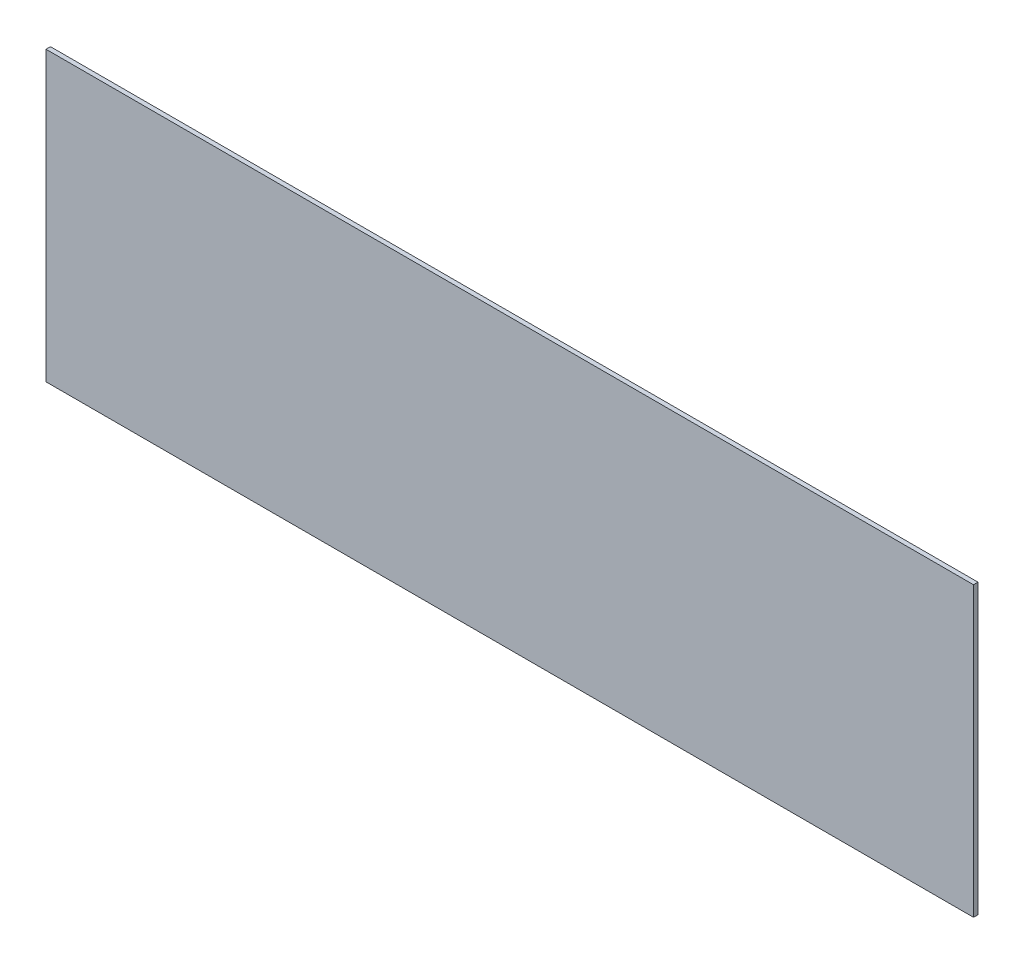
ISO-10303-21;
HEADER;
FILE_DESCRIPTION(('STEP AP214'),'2;1');
FILE_NAME('part.step','',(''),(''),'','','');
FILE_SCHEMA(('AUTOMOTIVE_DESIGN { 1 0 10303 214 1 1 1 1 }'));
ENDSEC;
DATA;
#1=APPLICATION_CONTEXT('core data for automotive mechanical design processes');
#2=APPLICATION_PROTOCOL_DEFINITION('international standard','automotive_design',2000,#1);
#3=PRODUCT_CONTEXT('',#1,'mechanical');
#4=PRODUCT('Part','Part','',(#3));
#5=PRODUCT_RELATED_PRODUCT_CATEGORY('part','',(#4));
#6=PRODUCT_DEFINITION_FORMATION('','',#4);
#7=PRODUCT_DEFINITION_CONTEXT('part definition',#1,'design');
#8=PRODUCT_DEFINITION('design','',#6,#7);
#9=PRODUCT_DEFINITION_SHAPE('','',#8);
#10=(LENGTH_UNIT() NAMED_UNIT(*) SI_UNIT(.MILLI.,.METRE.));
#11=(NAMED_UNIT(*) PLANE_ANGLE_UNIT() SI_UNIT($,.RADIAN.));
#12=(NAMED_UNIT(*) SI_UNIT($,.STERADIAN.) SOLID_ANGLE_UNIT());
#13=UNCERTAINTY_MEASURE_WITH_UNIT(LENGTH_MEASURE(1.E-05),#10,'distance_accuracy_value','');
#14=(GEOMETRIC_REPRESENTATION_CONTEXT(3) GLOBAL_UNCERTAINTY_ASSIGNED_CONTEXT((#13)) GLOBAL_UNIT_ASSIGNED_CONTEXT((#10,
#11,#12)) REPRESENTATION_CONTEXT('',''));
#15=CARTESIAN_POINT('',(0.,0.,0.));
#16=DIRECTION('',(0.,0.,1.));
#17=DIRECTION('',(1.,0.,0.));
#18=AXIS2_PLACEMENT_3D('',#15,#16,#17);
#19=CARTESIAN_POINT('',(0.,0.,3.175));
#20=DIRECTION('',(-1.,0.,0.));
#21=DIRECTION('',(0.,-1.,0.));
#22=AXIS2_PLACEMENT_3D('',#19,#20,#21);
#23=PLANE('',#22);
#24=DIRECTION('',(0.,1.,0.));
#25=VECTOR('',#24,1.);
#26=CARTESIAN_POINT('',(0.,0.,0.));
#27=LINE('',#26,#25);
#28=CARTESIAN_POINT('',(0.,0.,0.));
#29=VERTEX_POINT('',#28);
#30=CARTESIAN_POINT('',(0.,204.216,0.));
#31=VERTEX_POINT('',#30);
#32=EDGE_CURVE('E107',#29,#31,#27,.T.);
#33=ORIENTED_EDGE('',*,*,#32,.T.);
#34=DIRECTION('',(0.,0.,-1.));
#35=VECTOR('',#34,1.);
#36=CARTESIAN_POINT('',(0.,204.216,3.175));
#37=LINE('',#36,#35);
#38=CARTESIAN_POINT('',(0.,204.216,3.175));
#39=VERTEX_POINT('',#38);
#40=EDGE_CURVE('E11',#39,#31,#37,.T.);
#41=ORIENTED_EDGE('',*,*,#40,.F.);
#42=DIRECTION('',(0.,1.,0.));
#43=VECTOR('',#42,1.);
#44=CARTESIAN_POINT('',(0.,0.,3.175));
#45=LINE('',#44,#43);
#46=CARTESIAN_POINT('',(0.,0.,3.175));
#47=VERTEX_POINT('',#46);
#48=EDGE_CURVE('E91',#47,#39,#45,.T.);
#49=ORIENTED_EDGE('',*,*,#48,.F.);
#50=DIRECTION('',(0.,0.,-1.));
#51=VECTOR('',#50,1.);
#52=CARTESIAN_POINT('',(0.,0.,3.175));
#53=LINE('',#52,#51);
#54=EDGE_CURVE('E103',#47,#29,#53,.T.);
#55=ORIENTED_EDGE('',*,*,#54,.T.);
#56=EDGE_LOOP('',(#33,#41,#49,#55));
#57=FACE_BOUND('',#56,.T.);
#58=ADVANCED_FACE('F39',(#57),#23,.F.);
#59=CARTESIAN_POINT('',(0.,204.216,3.175));
#60=DIRECTION('',(0.,-1.,0.));
#61=DIRECTION('',(1.,0.,0.));
#62=AXIS2_PLACEMENT_3D('',#59,#60,#61);
#63=PLANE('',#62);
#64=DIRECTION('',(-1.,0.,0.));
#65=VECTOR('',#64,1.);
#66=CARTESIAN_POINT('',(0.,204.216,0.));
#67=LINE('',#66,#65);
#68=CARTESIAN_POINT('',(-657.606,204.216,0.));
#69=VERTEX_POINT('',#68);
#70=EDGE_CURVE('E96',#31,#69,#67,.T.);
#71=ORIENTED_EDGE('',*,*,#70,.T.);
#72=DIRECTION('',(0.,0.,-1.));
#73=VECTOR('',#72,1.);
#74=CARTESIAN_POINT('',(-657.606,204.216,3.175));
#75=LINE('',#74,#73);
#76=CARTESIAN_POINT('',(-657.606,204.216,3.175));
#77=VERTEX_POINT('',#76);
#78=EDGE_CURVE('E48',#77,#69,#75,.T.);
#79=ORIENTED_EDGE('',*,*,#78,.F.);
#80=DIRECTION('',(-1.,0.,0.));
#81=VECTOR('',#80,1.);
#82=CARTESIAN_POINT('',(0.,204.216,3.175));
#83=LINE('',#82,#81);
#84=EDGE_CURVE('E86',#39,#77,#83,.T.);
#85=ORIENTED_EDGE('',*,*,#84,.F.);
#86=ORIENTED_EDGE('',*,*,#40,.T.);
#87=EDGE_LOOP('',(#71,#79,#85,#86));
#88=FACE_BOUND('',#87,.T.);
#89=ADVANCED_FACE('F95',(#88),#63,.F.);
#90=CARTESIAN_POINT('',(-657.606,0.,3.175));
#91=DIRECTION('',(1.,0.,0.));
#92=DIRECTION('',(0.,0.,-1.));
#93=AXIS2_PLACEMENT_3D('',#90,#91,#92);
#94=PLANE('',#93);
#95=DIRECTION('',(0.,-1.,0.));
#96=VECTOR('',#95,1.);
#97=CARTESIAN_POINT('',(-657.606,0.,0.));
#98=LINE('',#97,#96);
#99=CARTESIAN_POINT('',(-657.606,0.,0.));
#100=VERTEX_POINT('',#99);
#101=EDGE_CURVE('E73',#69,#100,#98,.T.);
#102=ORIENTED_EDGE('',*,*,#101,.T.);
#103=DIRECTION('',(0.,0.,-1.));
#104=VECTOR('',#103,1.);
#105=CARTESIAN_POINT('',(-657.606,0.,3.175));
#106=LINE('',#105,#104);
#107=CARTESIAN_POINT('',(-657.606,0.,3.175));
#108=VERTEX_POINT('',#107);
#109=EDGE_CURVE('E98',#108,#100,#106,.T.);
#110=ORIENTED_EDGE('',*,*,#109,.F.);
#111=DIRECTION('',(0.,-1.,0.));
#112=VECTOR('',#111,1.);
#113=CARTESIAN_POINT('',(-657.606,0.,3.175));
#114=LINE('',#113,#112);
#115=EDGE_CURVE('E89',#77,#108,#114,.T.);
#116=ORIENTED_EDGE('',*,*,#115,.F.);
#117=ORIENTED_EDGE('',*,*,#78,.T.);
#118=EDGE_LOOP('',(#102,#110,#116,#117));
#119=FACE_BOUND('',#118,.T.);
#120=ADVANCED_FACE('F99',(#119),#94,.F.);
#121=CARTESIAN_POINT('',(0.,0.,3.175));
#122=DIRECTION('',(0.,1.,0.));
#123=DIRECTION('',(0.,0.,1.));
#124=AXIS2_PLACEMENT_3D('',#121,#122,#123);
#125=PLANE('',#124);
#126=DIRECTION('',(1.,0.,0.));
#127=VECTOR('',#126,1.);
#128=CARTESIAN_POINT('',(0.,0.,0.));
#129=LINE('',#128,#127);
#130=EDGE_CURVE('E79',#100,#29,#129,.T.);
#131=ORIENTED_EDGE('',*,*,#130,.T.);
#132=ORIENTED_EDGE('',*,*,#54,.F.);
#133=DIRECTION('',(1.,0.,0.));
#134=VECTOR('',#133,1.);
#135=CARTESIAN_POINT('',(0.,0.,3.175));
#136=LINE('',#135,#134);
#137=EDGE_CURVE('E56',#108,#47,#136,.T.);
#138=ORIENTED_EDGE('',*,*,#137,.F.);
#139=ORIENTED_EDGE('',*,*,#109,.T.);
#140=EDGE_LOOP('',(#131,#132,#138,#139));
#141=FACE_BOUND('',#140,.T.);
#142=ADVANCED_FACE('F120',(#141),#125,.F.);
#143=CARTESIAN_POINT('',(0.,0.,3.175));
#144=DIRECTION('',(0.,0.,1.));
#145=DIRECTION('',(1.,0.,0.));
#146=AXIS2_PLACEMENT_3D('',#143,#144,#145);
#147=PLANE('',#146);
#148=ORIENTED_EDGE('',*,*,#48,.T.);
#149=ORIENTED_EDGE('',*,*,#84,.T.);
#150=ORIENTED_EDGE('',*,*,#115,.T.);
#151=ORIENTED_EDGE('',*,*,#137,.T.);
#152=EDGE_LOOP('',(#148,#149,#150,#151));
#153=FACE_BOUND('',#152,.T.);
#154=ADVANCED_FACE('F87',(#153),#147,.T.);
#155=CARTESIAN_POINT('',(0.,0.,0.));
#156=DIRECTION('',(0.,0.,1.));
#157=DIRECTION('',(1.,0.,0.));
#158=AXIS2_PLACEMENT_3D('',#155,#156,#157);
#159=PLANE('',#158);
#160=ORIENTED_EDGE('',*,*,#32,.F.);
#161=ORIENTED_EDGE('',*,*,#130,.F.);
#162=ORIENTED_EDGE('',*,*,#101,.F.);
#163=ORIENTED_EDGE('',*,*,#70,.F.);
#164=EDGE_LOOP('',(#160,#161,#162,#163));
#165=FACE_BOUND('',#164,.T.);
#166=ADVANCED_FACE('F123',(#165),#159,.F.);
#167=CLOSED_SHELL('',(#58,#89,#120,#142,#154,#166));
#168=MANIFOLD_SOLID_BREP('B2',#167);
#169=ADVANCED_BREP_SHAPE_REPRESENTATION('',(#18,#168),#14);
#170=SHAPE_DEFINITION_REPRESENTATION(#9,#169);
ENDSEC;
END-ISO-10303-21;
